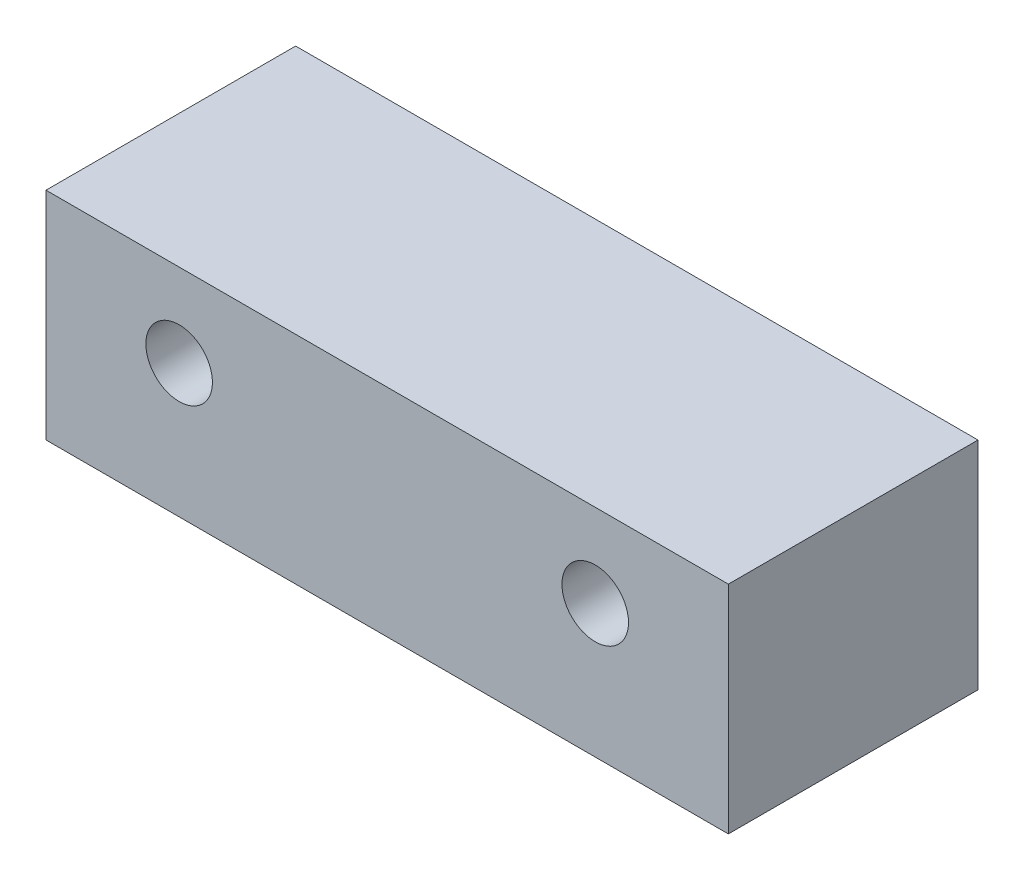
ISO-10303-21;
HEADER;
FILE_DESCRIPTION(('STEP AP214'),'2;1');
FILE_NAME('part.step','',(''),(''),'','','');
FILE_SCHEMA(('AUTOMOTIVE_DESIGN { 1 0 10303 214 1 1 1 1 }'));
ENDSEC;
DATA;
#1=APPLICATION_CONTEXT('core data for automotive mechanical design processes');
#2=APPLICATION_PROTOCOL_DEFINITION('international standard','automotive_design',2000,#1);
#3=PRODUCT_CONTEXT('',#1,'mechanical');
#4=PRODUCT('Part','Part','',(#3));
#5=PRODUCT_RELATED_PRODUCT_CATEGORY('part','',(#4));
#6=PRODUCT_DEFINITION_FORMATION('','',#4);
#7=PRODUCT_DEFINITION_CONTEXT('part definition',#1,'design');
#8=PRODUCT_DEFINITION('design','',#6,#7);
#9=PRODUCT_DEFINITION_SHAPE('','',#8);
#10=(LENGTH_UNIT() NAMED_UNIT(*) SI_UNIT(.MILLI.,.METRE.));
#11=(NAMED_UNIT(*) PLANE_ANGLE_UNIT() SI_UNIT($,.RADIAN.));
#12=(NAMED_UNIT(*) SI_UNIT($,.STERADIAN.) SOLID_ANGLE_UNIT());
#13=UNCERTAINTY_MEASURE_WITH_UNIT(LENGTH_MEASURE(1.E-05),#10,'distance_accuracy_value','');
#14=(GEOMETRIC_REPRESENTATION_CONTEXT(3) GLOBAL_UNCERTAINTY_ASSIGNED_CONTEXT((#13)) GLOBAL_UNIT_ASSIGNED_CONTEXT((#10,
#11,#12)) REPRESENTATION_CONTEXT('',''));
#15=CARTESIAN_POINT('',(0.,0.,0.));
#16=DIRECTION('',(0.,0.,1.));
#17=DIRECTION('',(1.,0.,0.));
#18=AXIS2_PLACEMENT_3D('',#15,#16,#17);
#19=CARTESIAN_POINT('',(0.,0.,15.));
#20=DIRECTION('',(0.,0.,-1.));
#21=DIRECTION('',(-1.,0.,0.));
#22=AXIS2_PLACEMENT_3D('',#19,#20,#21);
#23=PLANE('',#22);
#24=DIRECTION('',(0.,1.,0.));
#25=VECTOR('',#24,1.);
#26=CARTESIAN_POINT('',(20.5,-5.,15.));
#27=LINE('',#26,#25);
#28=CARTESIAN_POINT('',(20.5,-8.,15.));
#29=VERTEX_POINT('',#28);
#30=CARTESIAN_POINT('',(20.5,5.,15.));
#31=VERTEX_POINT('',#30);
#32=EDGE_CURVE('E100',#29,#31,#27,.T.);
#33=ORIENTED_EDGE('',*,*,#32,.T.);
#34=DIRECTION('',(-1.,0.,0.));
#35=VECTOR('',#34,1.);
#36=CARTESIAN_POINT('',(-20.5,5.,15.));
#37=LINE('',#36,#35);
#38=CARTESIAN_POINT('',(-20.5,5.,15.));
#39=VERTEX_POINT('',#38);
#40=EDGE_CURVE('E58',#31,#39,#37,.T.);
#41=ORIENTED_EDGE('',*,*,#40,.T.);
#42=DIRECTION('',(0.,-1.,0.));
#43=VECTOR('',#42,1.);
#44=CARTESIAN_POINT('',(-20.5,-5.,15.));
#45=LINE('',#44,#43);
#46=CARTESIAN_POINT('',(-20.5,-8.,15.));
#47=VERTEX_POINT('',#46);
#48=EDGE_CURVE('E74',#39,#47,#45,.T.);
#49=ORIENTED_EDGE('',*,*,#48,.T.);
#50=DIRECTION('',(1.,0.,0.));
#51=VECTOR('',#50,1.);
#52=CARTESIAN_POINT('',(-20.5,-8.,15.));
#53=LINE('',#52,#51);
#54=EDGE_CURVE('E106',#47,#29,#53,.T.);
#55=ORIENTED_EDGE('',*,*,#54,.T.);
#56=EDGE_LOOP('',(#33,#41,#49,#55));
#57=FACE_BOUND('',#56,.T.);
#58=CARTESIAN_POINT('',(12.5,0.,15.));
#59=DIRECTION('',(0.,0.,1.));
#60=DIRECTION('',(1.,0.,0.));
#61=AXIS2_PLACEMENT_3D('',#58,#59,#60);
#62=CIRCLE('',#61,2.);
#63=CARTESIAN_POINT('',(14.5,0.,15.));
#64=VERTEX_POINT('',#63);
#65=EDGE_CURVE('E96',#64,#64,#62,.T.);
#66=ORIENTED_EDGE('',*,*,#65,.F.);
#67=EDGE_LOOP('',(#66));
#68=FACE_BOUND('',#67,.T.);
#69=CARTESIAN_POINT('',(-12.5,0.,15.));
#70=DIRECTION('',(0.,0.,1.));
#71=DIRECTION('',(-1.,0.,0.));
#72=AXIS2_PLACEMENT_3D('',#69,#70,#71);
#73=CIRCLE('',#72,2.);
#74=CARTESIAN_POINT('',(-14.5,0.,15.));
#75=VERTEX_POINT('',#74);
#76=EDGE_CURVE('E112',#75,#75,#73,.T.);
#77=ORIENTED_EDGE('',*,*,#76,.F.);
#78=EDGE_LOOP('',(#77));
#79=FACE_BOUND('',#78,.T.);
#80=ADVANCED_FACE('F41',(#57,#68,#79),#23,.F.);
#81=CARTESIAN_POINT('',(0.,0.,0.));
#82=DIRECTION('',(0.,0.,-1.));
#83=DIRECTION('',(-1.,0.,0.));
#84=AXIS2_PLACEMENT_3D('',#81,#82,#83);
#85=PLANE('',#84);
#86=CARTESIAN_POINT('',(12.5,0.,0.));
#87=DIRECTION('',(0.,0.,1.));
#88=DIRECTION('',(1.,0.,0.));
#89=AXIS2_PLACEMENT_3D('',#86,#87,#88);
#90=CIRCLE('',#89,2.);
#91=CARTESIAN_POINT('',(14.5,0.,0.));
#92=VERTEX_POINT('',#91);
#93=EDGE_CURVE('E115',#92,#92,#90,.T.);
#94=ORIENTED_EDGE('',*,*,#93,.T.);
#95=EDGE_LOOP('',(#94));
#96=FACE_BOUND('',#95,.T.);
#97=DIRECTION('',(0.,1.,0.));
#98=VECTOR('',#97,1.);
#99=CARTESIAN_POINT('',(20.5,-5.,0.));
#100=LINE('',#99,#98);
#101=CARTESIAN_POINT('',(20.5,-8.,0.));
#102=VERTEX_POINT('',#101);
#103=CARTESIAN_POINT('',(20.5,5.,0.));
#104=VERTEX_POINT('',#103);
#105=EDGE_CURVE('E87',#102,#104,#100,.T.);
#106=ORIENTED_EDGE('',*,*,#105,.F.);
#107=DIRECTION('',(1.,0.,0.));
#108=VECTOR('',#107,1.);
#109=CARTESIAN_POINT('',(-20.5,-8.,0.));
#110=LINE('',#109,#108);
#111=CARTESIAN_POINT('',(-20.5,-8.,0.));
#112=VERTEX_POINT('',#111);
#113=EDGE_CURVE('E92',#112,#102,#110,.T.);
#114=ORIENTED_EDGE('',*,*,#113,.F.);
#115=DIRECTION('',(0.,-1.,0.));
#116=VECTOR('',#115,1.);
#117=CARTESIAN_POINT('',(-20.5,-5.,0.));
#118=LINE('',#117,#116);
#119=CARTESIAN_POINT('',(-20.5,5.,0.));
#120=VERTEX_POINT('',#119);
#121=EDGE_CURVE('E84',#120,#112,#118,.T.);
#122=ORIENTED_EDGE('',*,*,#121,.F.);
#123=DIRECTION('',(-1.,0.,0.));
#124=VECTOR('',#123,1.);
#125=CARTESIAN_POINT('',(-20.5,5.,0.));
#126=LINE('',#125,#124);
#127=EDGE_CURVE('E69',#104,#120,#126,.T.);
#128=ORIENTED_EDGE('',*,*,#127,.F.);
#129=EDGE_LOOP('',(#106,#114,#122,#128));
#130=FACE_BOUND('',#129,.T.);
#131=CARTESIAN_POINT('',(-12.5,0.,0.));
#132=DIRECTION('',(0.,0.,1.));
#133=DIRECTION('',(-1.,0.,0.));
#134=AXIS2_PLACEMENT_3D('',#131,#132,#133);
#135=CIRCLE('',#134,2.);
#136=CARTESIAN_POINT('',(-14.5,0.,0.));
#137=VERTEX_POINT('',#136);
#138=EDGE_CURVE('E111',#137,#137,#135,.T.);
#139=ORIENTED_EDGE('',*,*,#138,.T.);
#140=EDGE_LOOP('',(#139));
#141=FACE_BOUND('',#140,.T.);
#142=ADVANCED_FACE('F89',(#96,#130,#141),#85,.T.);
#143=CARTESIAN_POINT('',(20.5,-5.,15.));
#144=DIRECTION('',(-1.,0.,0.));
#145=DIRECTION('',(0.,0.,1.));
#146=AXIS2_PLACEMENT_3D('',#143,#144,#145);
#147=PLANE('',#146);
#148=ORIENTED_EDGE('',*,*,#105,.T.);
#149=DIRECTION('',(0.,0.,-1.));
#150=VECTOR('',#149,1.);
#151=CARTESIAN_POINT('',(20.5,5.,15.));
#152=LINE('',#151,#150);
#153=EDGE_CURVE('E11',#31,#104,#152,.T.);
#154=ORIENTED_EDGE('',*,*,#153,.F.);
#155=ORIENTED_EDGE('',*,*,#32,.F.);
#156=DIRECTION('',(0.,0.,1.));
#157=VECTOR('',#156,1.);
#158=CARTESIAN_POINT('',(20.5,-8.,-41.1096095821889));
#159=LINE('',#158,#157);
#160=EDGE_CURVE('E99',#102,#29,#159,.T.);
#161=ORIENTED_EDGE('',*,*,#160,.F.);
#162=EDGE_LOOP('',(#148,#154,#155,#161));
#163=FACE_BOUND('',#162,.T.);
#164=ADVANCED_FACE('F43',(#163),#147,.F.);
#165=CARTESIAN_POINT('',(-20.5,5.,15.));
#166=DIRECTION('',(0.,-1.,0.));
#167=DIRECTION('',(0.,0.,-1.));
#168=AXIS2_PLACEMENT_3D('',#165,#166,#167);
#169=PLANE('',#168);
#170=ORIENTED_EDGE('',*,*,#127,.T.);
#171=DIRECTION('',(0.,0.,-1.));
#172=VECTOR('',#171,1.);
#173=CARTESIAN_POINT('',(-20.5,5.,15.));
#174=LINE('',#173,#172);
#175=EDGE_CURVE('E50',#39,#120,#174,.T.);
#176=ORIENTED_EDGE('',*,*,#175,.F.);
#177=ORIENTED_EDGE('',*,*,#40,.F.);
#178=ORIENTED_EDGE('',*,*,#153,.T.);
#179=EDGE_LOOP('',(#170,#176,#177,#178));
#180=FACE_BOUND('',#179,.T.);
#181=ADVANCED_FACE('F128',(#180),#169,.F.);
#182=CARTESIAN_POINT('',(-20.5,-5.,15.));
#183=DIRECTION('',(1.,0.,0.));
#184=DIRECTION('',(0.,0.,-1.));
#185=AXIS2_PLACEMENT_3D('',#182,#183,#184);
#186=PLANE('',#185);
#187=ORIENTED_EDGE('',*,*,#121,.T.);
#188=DIRECTION('',(0.,0.,1.));
#189=VECTOR('',#188,1.);
#190=CARTESIAN_POINT('',(-20.5,-8.,-41.1096095821889));
#191=LINE('',#190,#189);
#192=EDGE_CURVE('E103',#112,#47,#191,.T.);
#193=ORIENTED_EDGE('',*,*,#192,.T.);
#194=ORIENTED_EDGE('',*,*,#48,.F.);
#195=ORIENTED_EDGE('',*,*,#175,.T.);
#196=EDGE_LOOP('',(#187,#193,#194,#195));
#197=FACE_BOUND('',#196,.T.);
#198=ADVANCED_FACE('F126',(#197),#186,.F.);
#199=CARTESIAN_POINT('',(12.5,0.,15.));
#200=DIRECTION('',(0.,0.,-1.));
#201=DIRECTION('',(-1.,0.,0.));
#202=AXIS2_PLACEMENT_3D('',#199,#200,#201);
#203=CYLINDRICAL_SURFACE('',#202,2.);
#204=ORIENTED_EDGE('',*,*,#65,.T.);
#205=EDGE_LOOP('',(#204));
#206=FACE_BOUND('',#205,.T.);
#207=ORIENTED_EDGE('',*,*,#93,.F.);
#208=EDGE_LOOP('',(#207));
#209=FACE_BOUND('',#208,.T.);
#210=ADVANCED_FACE('F139',(#206,#209),#203,.F.);
#211=CARTESIAN_POINT('',(-12.5,0.,15.));
#212=DIRECTION('',(0.,0.,-1.));
#213=DIRECTION('',(-1.,0.,0.));
#214=AXIS2_PLACEMENT_3D('',#211,#212,#213);
#215=CYLINDRICAL_SURFACE('',#214,2.);
#216=ORIENTED_EDGE('',*,*,#76,.T.);
#217=EDGE_LOOP('',(#216));
#218=FACE_BOUND('',#217,.T.);
#219=ORIENTED_EDGE('',*,*,#138,.F.);
#220=EDGE_LOOP('',(#219));
#221=FACE_BOUND('',#220,.T.);
#222=ADVANCED_FACE('F136',(#218,#221),#215,.F.);
#223=CARTESIAN_POINT('',(-20.5,-8.,-41.1096095821889));
#224=DIRECTION('',(0.,-1.,0.));
#225=DIRECTION('',(0.,0.,-1.));
#226=AXIS2_PLACEMENT_3D('',#223,#224,#225);
#227=PLANE('',#226);
#228=ORIENTED_EDGE('',*,*,#192,.F.);
#229=ORIENTED_EDGE('',*,*,#113,.T.);
#230=ORIENTED_EDGE('',*,*,#160,.T.);
#231=ORIENTED_EDGE('',*,*,#54,.F.);
#232=EDGE_LOOP('',(#228,#229,#230,#231));
#233=FACE_BOUND('',#232,.T.);
#234=ADVANCED_FACE('F105',(#233),#227,.T.);
#235=CLOSED_SHELL('',(#80,#142,#164,#181,#198,#210,#222,#234));
#236=MANIFOLD_SOLID_BREP('B2',#235);
#237=ADVANCED_BREP_SHAPE_REPRESENTATION('',(#18,#236),#14);
#238=SHAPE_DEFINITION_REPRESENTATION(#9,#237);
ENDSEC;
END-ISO-10303-21;
